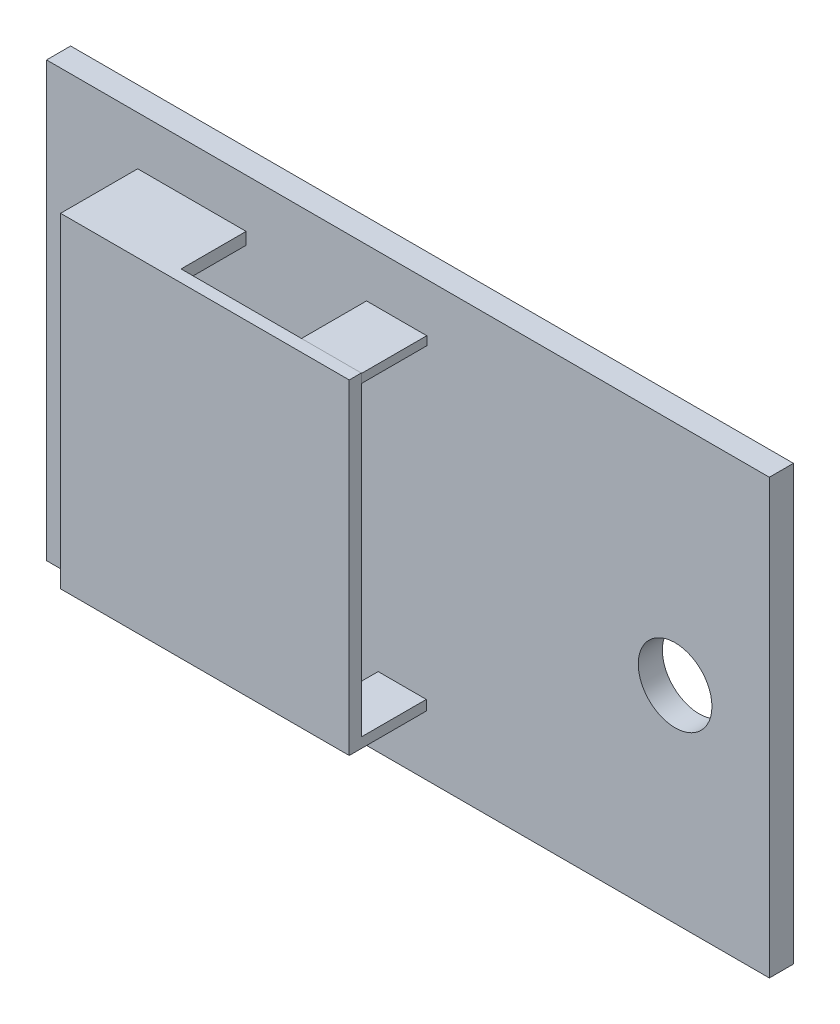
ISO-10303-21;
HEADER;
FILE_DESCRIPTION(('STEP AP214'),'2;1');
FILE_NAME('part.step','',(''),(''),'','','');
FILE_SCHEMA(('AUTOMOTIVE_DESIGN { 1 0 10303 214 1 1 1 1 }'));
ENDSEC;
DATA;
#1=APPLICATION_CONTEXT('core data for automotive mechanical design processes');
#2=APPLICATION_PROTOCOL_DEFINITION('international standard','automotive_design',2000,#1);
#3=PRODUCT_CONTEXT('',#1,'mechanical');
#4=PRODUCT('Part','Part','',(#3));
#5=PRODUCT_RELATED_PRODUCT_CATEGORY('part','',(#4));
#6=PRODUCT_DEFINITION_FORMATION('','',#4);
#7=PRODUCT_DEFINITION_CONTEXT('part definition',#1,'design');
#8=PRODUCT_DEFINITION('design','',#6,#7);
#9=PRODUCT_DEFINITION_SHAPE('','',#8);
#10=(LENGTH_UNIT() NAMED_UNIT(*) SI_UNIT(.MILLI.,.METRE.));
#11=(NAMED_UNIT(*) PLANE_ANGLE_UNIT() SI_UNIT($,.RADIAN.));
#12=(NAMED_UNIT(*) SI_UNIT($,.STERADIAN.) SOLID_ANGLE_UNIT());
#13=UNCERTAINTY_MEASURE_WITH_UNIT(LENGTH_MEASURE(1.E-05),#10,'distance_accuracy_value','');
#14=(GEOMETRIC_REPRESENTATION_CONTEXT(3) GLOBAL_UNCERTAINTY_ASSIGNED_CONTEXT((#13)) GLOBAL_UNIT_ASSIGNED_CONTEXT((#10,
#11,#12)) REPRESENTATION_CONTEXT('',''));
#15=CARTESIAN_POINT('',(0.,0.,0.));
#16=DIRECTION('',(0.,0.,1.));
#17=DIRECTION('',(1.,0.,0.));
#18=AXIS2_PLACEMENT_3D('',#15,#16,#17);
#19=CARTESIAN_POINT('',(0.,0.,37.));
#20=DIRECTION('',(0.,0.,-1.));
#21=DIRECTION('',(-1.,0.,0.));
#22=AXIS2_PLACEMENT_3D('',#19,#20,#21);
#23=PLANE('',#22);
#24=DIRECTION('',(0.,1.,0.));
#25=VECTOR('',#24,1.);
#26=CARTESIAN_POINT('',(58.2309614627117,13.2146675759325,37.));
#27=LINE('',#26,#25);
#28=CARTESIAN_POINT('',(58.2309614627117,9.58317186335365,37.));
#29=VERTEX_POINT('',#28);
#30=CARTESIAN_POINT('',(58.2309614627117,13.2085531623903,37.));
#31=VERTEX_POINT('',#30);
#32=EDGE_CURVE('E61',#29,#31,#27,.T.);
#33=ORIENTED_EDGE('',*,*,#32,.F.);
#34=DIRECTION('',(1.,0.,0.));
#35=VECTOR('',#34,1.);
#36=CARTESIAN_POINT('',(33.4142818054913,9.58317186335365,37.));
#37=LINE('',#36,#35);
#38=CARTESIAN_POINT('',(58.4142818054913,9.58317186335365,37.));
#39=VERTEX_POINT('',#38);
#40=EDGE_CURVE('E349',#29,#39,#37,.T.);
#41=ORIENTED_EDGE('',*,*,#40,.T.);
#42=DIRECTION('',(0.,1.,0.));
#43=VECTOR('',#42,1.);
#44=CARTESIAN_POINT('',(58.4142818054913,9.58317186335365,37.));
#45=LINE('',#44,#43);
#46=CARTESIAN_POINT('',(58.4142818054913,13.2085531623903,37.));
#47=VERTEX_POINT('',#46);
#48=EDGE_CURVE('E346',#39,#47,#45,.T.);
#49=ORIENTED_EDGE('',*,*,#48,.T.);
#50=DIRECTION('',(-1.,0.,0.));
#51=VECTOR('',#50,1.);
#52=CARTESIAN_POINT('',(33.4142818054913,13.2085531623903,37.));
#53=LINE('',#52,#51);
#54=EDGE_CURVE('E329',#47,#31,#53,.T.);
#55=ORIENTED_EDGE('',*,*,#54,.T.);
#56=EDGE_LOOP('',(#33,#41,#49,#55));
#57=FACE_BOUND('',#56,.T.);
#58=ADVANCED_FACE('F45',(#57),#23,.F.);
#59=CARTESIAN_POINT('',(0.,0.,10.));
#60=DIRECTION('',(0.,0.,1.));
#61=DIRECTION('',(1.,0.,0.));
#62=AXIS2_PLACEMENT_3D('',#59,#60,#61);
#63=PLANE('',#62);
#64=DIRECTION('',(0.,-1.,0.));
#65=VECTOR('',#64,1.);
#66=CARTESIAN_POINT('',(-99.3975903614459,33.433734939759,10.));
#67=LINE('',#66,#65);
#68=CARTESIAN_POINT('',(-99.3975903614459,33.433734939759,10.));
#69=VERTEX_POINT('',#68);
#70=CARTESIAN_POINT('',(-99.3975903614458,-146.566265060241,10.));
#71=VERTEX_POINT('',#70);
#72=EDGE_CURVE('E398',#69,#71,#67,.T.);
#73=ORIENTED_EDGE('',*,*,#72,.T.);
#74=DIRECTION('',(1.,0.,0.));
#75=VECTOR('',#74,1.);
#76=CARTESIAN_POINT('',(-99.3975903614458,-146.566265060241,10.));
#77=LINE('',#76,#75);
#78=CARTESIAN_POINT('',(200.602409638554,-146.566265060241,10.));
#79=VERTEX_POINT('',#78);
#80=EDGE_CURVE('E402',#71,#79,#77,.T.);
#81=ORIENTED_EDGE('',*,*,#80,.T.);
#82=DIRECTION('',(0.,1.,0.));
#83=VECTOR('',#82,1.);
#84=CARTESIAN_POINT('',(200.602409638554,33.433734939759,10.));
#85=LINE('',#84,#83);
#86=CARTESIAN_POINT('',(200.602409638554,33.433734939759,10.));
#87=VERTEX_POINT('',#86);
#88=EDGE_CURVE('E406',#79,#87,#85,.T.);
#89=ORIENTED_EDGE('',*,*,#88,.T.);
#90=DIRECTION('',(-1.,0.,0.));
#91=VECTOR('',#90,1.);
#92=CARTESIAN_POINT('',(-99.3975903614459,33.433734939759,10.));
#93=LINE('',#92,#91);
#94=EDGE_CURVE('E409',#87,#69,#93,.T.);
#95=ORIENTED_EDGE('',*,*,#94,.T.);
#96=EDGE_LOOP('',(#73,#81,#89,#95));
#97=FACE_BOUND('',#96,.T.);
#98=CARTESIAN_POINT('',(161.47442169969,-60.8983015499577,10.));
#99=DIRECTION('',(0.,0.,1.));
#100=DIRECTION('',(1.,0.,0.));
#101=AXIS2_PLACEMENT_3D('',#98,#99,#100);
#102=CIRCLE('',#101,15.2902951864238);
#103=CARTESIAN_POINT('',(176.764716886113,-60.8983015499577,10.));
#104=VERTEX_POINT('',#103);
#105=EDGE_CURVE('E390',#104,#104,#102,.T.);
#106=ORIENTED_EDGE('',*,*,#105,.F.);
#107=EDGE_LOOP('',(#106));
#108=FACE_BOUND('',#107,.T.);
#109=DIRECTION('',(1.,0.,0.));
#110=VECTOR('',#109,1.);
#111=CARTESIAN_POINT('',(38.2309614627117,-121.785332424067,10.));
#112=LINE('',#111,#110);
#113=CARTESIAN_POINT('',(38.2309614627117,-121.785332424067,10.));
#114=VERTEX_POINT('',#113);
#115=CARTESIAN_POINT('',(58.2309614627117,-121.785332424067,10.));
#116=VERTEX_POINT('',#115);
#117=EDGE_CURVE('E378',#114,#116,#112,.T.);
#118=ORIENTED_EDGE('',*,*,#117,.F.);
#119=DIRECTION('',(0.,-1.,0.));
#120=VECTOR('',#119,1.);
#121=CARTESIAN_POINT('',(38.2309614627117,-121.785332424067,10.));
#122=LINE('',#121,#120);
#123=CARTESIAN_POINT('',(38.2309614627117,-117.612412657303,10.));
#124=VERTEX_POINT('',#123);
#125=EDGE_CURVE('E318',#124,#114,#122,.T.);
#126=ORIENTED_EDGE('',*,*,#125,.F.);
#127=DIRECTION('',(-1.,0.,0.));
#128=VECTOR('',#127,1.);
#129=CARTESIAN_POINT('',(38.2309614627117,-117.612412657303,10.));
#130=LINE('',#129,#128);
#131=CARTESIAN_POINT('',(58.2309614627117,-117.612412657303,10.));
#132=VERTEX_POINT('',#131);
#133=EDGE_CURVE('E370',#132,#124,#130,.T.);
#134=ORIENTED_EDGE('',*,*,#133,.F.);
#135=DIRECTION('',(0.,1.,0.));
#136=VECTOR('',#135,1.);
#137=CARTESIAN_POINT('',(58.2309614627117,-121.785332424067,10.));
#138=LINE('',#137,#136);
#139=EDGE_CURVE('E373',#116,#132,#138,.T.);
#140=ORIENTED_EDGE('',*,*,#139,.F.);
#141=EDGE_LOOP('',(#118,#126,#134,#140));
#142=FACE_BOUND('',#141,.T.);
#143=DIRECTION('',(1.,0.,0.));
#144=VECTOR('',#143,1.);
#145=CARTESIAN_POINT('',(33.4142818054913,9.58317186335365,10.));
#146=LINE('',#145,#144);
#147=CARTESIAN_POINT('',(33.4142818054913,9.58317186335365,10.));
#148=VERTEX_POINT('',#147);
#149=CARTESIAN_POINT('',(58.4142818054913,9.58317186335365,10.));
#150=VERTEX_POINT('',#149);
#151=EDGE_CURVE('E338',#148,#150,#146,.T.);
#152=ORIENTED_EDGE('',*,*,#151,.F.);
#153=DIRECTION('',(0.,-1.,0.));
#154=VECTOR('',#153,1.);
#155=CARTESIAN_POINT('',(33.4142818054913,9.58317186335365,10.));
#156=LINE('',#155,#154);
#157=CARTESIAN_POINT('',(33.4142818054913,13.2085531623903,10.));
#158=VERTEX_POINT('',#157);
#159=EDGE_CURVE('E271',#158,#148,#156,.T.);
#160=ORIENTED_EDGE('',*,*,#159,.F.);
#161=DIRECTION('',(-1.,0.,0.));
#162=VECTOR('',#161,1.);
#163=CARTESIAN_POINT('',(33.4142818054913,13.2085531623903,10.));
#164=LINE('',#163,#162);
#165=CARTESIAN_POINT('',(58.4142818054913,13.2085531623903,10.));
#166=VERTEX_POINT('',#165);
#167=EDGE_CURVE('E330',#166,#158,#164,.T.);
#168=ORIENTED_EDGE('',*,*,#167,.F.);
#169=DIRECTION('',(0.,1.,0.));
#170=VECTOR('',#169,1.);
#171=CARTESIAN_POINT('',(58.4142818054913,9.58317186335365,10.));
#172=LINE('',#171,#170);
#173=EDGE_CURVE('E333',#150,#166,#172,.T.);
#174=ORIENTED_EDGE('',*,*,#173,.F.);
#175=EDGE_LOOP('',(#152,#160,#168,#174));
#176=FACE_BOUND('',#175,.T.);
#177=DIRECTION('',(1.,0.,0.));
#178=VECTOR('',#177,1.);
#179=CARTESIAN_POINT('',(-61.5669866459527,-121.785332424067,10.));
#180=LINE('',#179,#178);
#181=CARTESIAN_POINT('',(-61.5669866459527,-121.785332424067,10.));
#182=VERTEX_POINT('',#181);
#183=CARTESIAN_POINT('',(20.4330133540473,-121.785332424067,10.));
#184=VERTEX_POINT('',#183);
#185=EDGE_CURVE('E270',#182,#184,#180,.T.);
#186=ORIENTED_EDGE('',*,*,#185,.F.);
#187=DIRECTION('',(0.,-1.,0.));
#188=VECTOR('',#187,1.);
#189=CARTESIAN_POINT('',(-61.5669866459527,-116.785332424067,10.));
#190=LINE('',#189,#188);
#191=CARTESIAN_POINT('',(-61.5669866459527,13.2146675759325,10.));
#192=VERTEX_POINT('',#191);
#193=EDGE_CURVE('E202',#192,#182,#190,.T.);
#194=ORIENTED_EDGE('',*,*,#193,.F.);
#195=DIRECTION('',(-1.,0.,0.));
#196=VECTOR('',#195,1.);
#197=CARTESIAN_POINT('',(-56.5669866459527,13.2146675759325,10.));
#198=LINE('',#197,#196);
#199=CARTESIAN_POINT('',(-16.5669866459527,13.2146675759325,10.));
#200=VERTEX_POINT('',#199);
#201=EDGE_CURVE('E251',#200,#192,#198,.T.);
#202=ORIENTED_EDGE('',*,*,#201,.F.);
#203=DIRECTION('',(0.,1.,0.));
#204=VECTOR('',#203,1.);
#205=CARTESIAN_POINT('',(-16.5669866459527,8.21466757593252,10.));
#206=LINE('',#205,#204);
#207=CARTESIAN_POINT('',(-16.5669866459527,8.21466757593252,10.));
#208=VERTEX_POINT('',#207);
#209=EDGE_CURVE('E286',#208,#200,#206,.T.);
#210=ORIENTED_EDGE('',*,*,#209,.F.);
#211=DIRECTION('',(1.,0.,0.));
#212=VECTOR('',#211,1.);
#213=CARTESIAN_POINT('',(-56.5669866459527,8.21466757593252,10.));
#214=LINE('',#213,#212);
#215=CARTESIAN_POINT('',(-56.5669866459527,8.21466757593252,10.));
#216=VERTEX_POINT('',#215);
#217=EDGE_CURVE('E283',#216,#208,#214,.T.);
#218=ORIENTED_EDGE('',*,*,#217,.F.);
#219=DIRECTION('',(0.,1.,0.));
#220=VECTOR('',#219,1.);
#221=CARTESIAN_POINT('',(-56.5669866459527,8.21466757593252,10.));
#222=LINE('',#221,#220);
#223=CARTESIAN_POINT('',(-56.5669866459527,-116.785332424067,10.));
#224=VERTEX_POINT('',#223);
#225=EDGE_CURVE('E280',#224,#216,#222,.T.);
#226=ORIENTED_EDGE('',*,*,#225,.F.);
#227=DIRECTION('',(-1.,0.,0.));
#228=VECTOR('',#227,1.);
#229=CARTESIAN_POINT('',(-56.5669866459527,-116.785332424067,10.));
#230=LINE('',#229,#228);
#231=CARTESIAN_POINT('',(20.4330133540473,-116.785332424067,10.));
#232=VERTEX_POINT('',#231);
#233=EDGE_CURVE('E277',#232,#224,#230,.T.);
#234=ORIENTED_EDGE('',*,*,#233,.F.);
#235=DIRECTION('',(0.,1.,0.));
#236=VECTOR('',#235,1.);
#237=CARTESIAN_POINT('',(20.4330133540473,-116.785332424067,10.));
#238=LINE('',#237,#236);
#239=EDGE_CURVE('E274',#184,#232,#238,.T.);
#240=ORIENTED_EDGE('',*,*,#239,.F.);
#241=EDGE_LOOP('',(#186,#194,#202,#210,#218,#226,#234,#240));
#242=FACE_BOUND('',#241,.T.);
#243=ADVANCED_FACE('F452',(#97,#108,#142,#176,#242),#63,.T.);
#244=CARTESIAN_POINT('',(0.,0.,0.));
#245=DIRECTION('',(0.,0.,1.));
#246=DIRECTION('',(1.,0.,0.));
#247=AXIS2_PLACEMENT_3D('',#244,#245,#246);
#248=PLANE('',#247);
#249=DIRECTION('',(0.,-1.,0.));
#250=VECTOR('',#249,1.);
#251=CARTESIAN_POINT('',(-99.3975903614459,33.433734939759,0.));
#252=LINE('',#251,#250);
#253=CARTESIAN_POINT('',(-99.3975903614459,33.433734939759,0.));
#254=VERTEX_POINT('',#253);
#255=CARTESIAN_POINT('',(-99.3975903614458,-146.566265060241,0.));
#256=VERTEX_POINT('',#255);
#257=EDGE_CURVE('E394',#254,#256,#252,.T.);
#258=ORIENTED_EDGE('',*,*,#257,.F.);
#259=DIRECTION('',(-1.,0.,0.));
#260=VECTOR('',#259,1.);
#261=CARTESIAN_POINT('',(-99.3975903614459,33.433734939759,0.));
#262=LINE('',#261,#260);
#263=CARTESIAN_POINT('',(200.602409638554,33.433734939759,0.));
#264=VERTEX_POINT('',#263);
#265=EDGE_CURVE('E403',#264,#254,#262,.T.);
#266=ORIENTED_EDGE('',*,*,#265,.F.);
#267=DIRECTION('',(0.,1.,0.));
#268=VECTOR('',#267,1.);
#269=CARTESIAN_POINT('',(200.602409638554,33.433734939759,0.));
#270=LINE('',#269,#268);
#271=CARTESIAN_POINT('',(200.602409638554,-146.566265060241,0.));
#272=VERTEX_POINT('',#271);
#273=EDGE_CURVE('E419',#272,#264,#270,.T.);
#274=ORIENTED_EDGE('',*,*,#273,.F.);
#275=DIRECTION('',(1.,0.,0.));
#276=VECTOR('',#275,1.);
#277=CARTESIAN_POINT('',(-99.3975903614458,-146.566265060241,0.));
#278=LINE('',#277,#276);
#279=EDGE_CURVE('E416',#256,#272,#278,.T.);
#280=ORIENTED_EDGE('',*,*,#279,.F.);
#281=EDGE_LOOP('',(#258,#266,#274,#280));
#282=FACE_BOUND('',#281,.T.);
#283=CARTESIAN_POINT('',(161.47442169969,-60.8983015499577,0.));
#284=DIRECTION('',(0.,0.,1.));
#285=DIRECTION('',(1.,0.,0.));
#286=AXIS2_PLACEMENT_3D('',#283,#284,#285);
#287=CIRCLE('',#286,15.2902951864238);
#288=CARTESIAN_POINT('',(176.764716886113,-60.8983015499577,0.));
#289=VERTEX_POINT('',#288);
#290=EDGE_CURVE('E206',#289,#289,#287,.T.);
#291=ORIENTED_EDGE('',*,*,#290,.T.);
#292=EDGE_LOOP('',(#291));
#293=FACE_BOUND('',#292,.T.);
#294=ADVANCED_FACE('F442',(#282,#293),#248,.F.);
#295=CARTESIAN_POINT('',(-99.3975903614459,33.433734939759,10.));
#296=DIRECTION('',(1.,0.,0.));
#297=DIRECTION('',(0.,1.,0.));
#298=AXIS2_PLACEMENT_3D('',#295,#296,#297);
#299=PLANE('',#298);
#300=ORIENTED_EDGE('',*,*,#257,.T.);
#301=DIRECTION('',(0.,0.,-1.));
#302=VECTOR('',#301,1.);
#303=CARTESIAN_POINT('',(-99.3975903614458,-146.566265060241,10.));
#304=LINE('',#303,#302);
#305=EDGE_CURVE('E11',#71,#256,#304,.T.);
#306=ORIENTED_EDGE('',*,*,#305,.F.);
#307=ORIENTED_EDGE('',*,*,#72,.F.);
#308=DIRECTION('',(0.,0.,-1.));
#309=VECTOR('',#308,1.);
#310=CARTESIAN_POINT('',(-99.3975903614459,33.433734939759,10.));
#311=LINE('',#310,#309);
#312=EDGE_CURVE('E412',#69,#254,#311,.T.);
#313=ORIENTED_EDGE('',*,*,#312,.T.);
#314=EDGE_LOOP('',(#300,#306,#307,#313));
#315=FACE_BOUND('',#314,.T.);
#316=ADVANCED_FACE('F47',(#315),#299,.F.);
#317=CARTESIAN_POINT('',(-99.3975903614458,-146.566265060241,10.));
#318=DIRECTION('',(0.,1.,0.));
#319=DIRECTION('',(0.,0.,1.));
#320=AXIS2_PLACEMENT_3D('',#317,#318,#319);
#321=PLANE('',#320);
#322=ORIENTED_EDGE('',*,*,#279,.T.);
#323=DIRECTION('',(0.,0.,-1.));
#324=VECTOR('',#323,1.);
#325=CARTESIAN_POINT('',(200.602409638554,-146.566265060241,10.));
#326=LINE('',#325,#324);
#327=EDGE_CURVE('E54',#79,#272,#326,.T.);
#328=ORIENTED_EDGE('',*,*,#327,.F.);
#329=ORIENTED_EDGE('',*,*,#80,.F.);
#330=ORIENTED_EDGE('',*,*,#305,.T.);
#331=EDGE_LOOP('',(#322,#328,#329,#330));
#332=FACE_BOUND('',#331,.T.);
#333=ADVANCED_FACE('F454',(#332),#321,.F.);
#334=CARTESIAN_POINT('',(200.602409638554,33.433734939759,10.));
#335=DIRECTION('',(-1.,0.,0.));
#336=DIRECTION('',(0.,0.,1.));
#337=AXIS2_PLACEMENT_3D('',#334,#335,#336);
#338=PLANE('',#337);
#339=ORIENTED_EDGE('',*,*,#273,.T.);
#340=DIRECTION('',(0.,0.,-1.));
#341=VECTOR('',#340,1.);
#342=CARTESIAN_POINT('',(200.602409638554,33.433734939759,10.));
#343=LINE('',#342,#341);
#344=EDGE_CURVE('E427',#87,#264,#343,.T.);
#345=ORIENTED_EDGE('',*,*,#344,.F.);
#346=ORIENTED_EDGE('',*,*,#88,.F.);
#347=ORIENTED_EDGE('',*,*,#327,.T.);
#348=EDGE_LOOP('',(#339,#345,#346,#347));
#349=FACE_BOUND('',#348,.T.);
#350=ADVANCED_FACE('F436',(#349),#338,.F.);
#351=CARTESIAN_POINT('',(-99.3975903614459,33.433734939759,10.));
#352=DIRECTION('',(0.,-1.,0.));
#353=DIRECTION('',(0.,0.,-1.));
#354=AXIS2_PLACEMENT_3D('',#351,#352,#353);
#355=PLANE('',#354);
#356=ORIENTED_EDGE('',*,*,#265,.T.);
#357=ORIENTED_EDGE('',*,*,#312,.F.);
#358=ORIENTED_EDGE('',*,*,#94,.F.);
#359=ORIENTED_EDGE('',*,*,#344,.T.);
#360=EDGE_LOOP('',(#356,#357,#358,#359));
#361=FACE_BOUND('',#360,.T.);
#362=ADVANCED_FACE('F446',(#361),#355,.F.);
#363=CARTESIAN_POINT('',(161.47442169969,-60.8983015499577,10.));
#364=DIRECTION('',(0.,0.,-1.));
#365=DIRECTION('',(-1.,0.,0.));
#366=AXIS2_PLACEMENT_3D('',#363,#364,#365);
#367=CYLINDRICAL_SURFACE('',#366,15.2902951864238);
#368=ORIENTED_EDGE('',*,*,#105,.T.);
#369=EDGE_LOOP('',(#368));
#370=FACE_BOUND('',#369,.T.);
#371=ORIENTED_EDGE('',*,*,#290,.F.);
#372=EDGE_LOOP('',(#371));
#373=FACE_BOUND('',#372,.T.);
#374=ADVANCED_FACE('F476',(#370,#373),#367,.F.);
#375=CARTESIAN_POINT('',(38.2309614627117,-121.785332424067,37.));
#376=DIRECTION('',(1.,0.,0.));
#377=DIRECTION('',(0.,0.,-1.));
#378=AXIS2_PLACEMENT_3D('',#375,#376,#377);
#379=PLANE('',#378);
#380=ORIENTED_EDGE('',*,*,#125,.T.);
#381=DIRECTION('',(0.,0.,-1.));
#382=VECTOR('',#381,1.);
#383=CARTESIAN_POINT('',(38.2309614627117,-121.785332424067,37.));
#384=LINE('',#383,#382);
#385=CARTESIAN_POINT('',(38.2309614627117,-121.785332424067,37.));
#386=VERTEX_POINT('',#385);
#387=EDGE_CURVE('E357',#386,#114,#384,.T.);
#388=ORIENTED_EDGE('',*,*,#387,.F.);
#389=DIRECTION('',(0.,-1.,0.));
#390=VECTOR('',#389,1.);
#391=CARTESIAN_POINT('',(38.2309614627117,-121.785332424067,37.));
#392=LINE('',#391,#390);
#393=CARTESIAN_POINT('',(38.2309614627117,-117.612412657303,37.));
#394=VERTEX_POINT('',#393);
#395=EDGE_CURVE('E374',#394,#386,#392,.T.);
#396=ORIENTED_EDGE('',*,*,#395,.F.);
#397=DIRECTION('',(0.,0.,-1.));
#398=VECTOR('',#397,1.);
#399=CARTESIAN_POINT('',(38.2309614627117,-117.612412657303,37.));
#400=LINE('',#399,#398);
#401=EDGE_CURVE('E365',#394,#124,#400,.T.);
#402=ORIENTED_EDGE('',*,*,#401,.T.);
#403=EDGE_LOOP('',(#380,#388,#396,#402));
#404=FACE_BOUND('',#403,.T.);
#405=ADVANCED_FACE('F473',(#404),#379,.F.);
#406=CARTESIAN_POINT('',(58.2309614627117,-121.785332424067,37.));
#407=DIRECTION('',(-1.,0.,0.));
#408=DIRECTION('',(0.,0.,1.));
#409=AXIS2_PLACEMENT_3D('',#406,#407,#408);
#410=PLANE('',#409);
#411=ORIENTED_EDGE('',*,*,#139,.T.);
#412=DIRECTION('',(0.,0.,-1.));
#413=VECTOR('',#412,1.);
#414=CARTESIAN_POINT('',(58.2309614627117,-117.612412657303,37.));
#415=LINE('',#414,#413);
#416=CARTESIAN_POINT('',(58.2309614627117,-117.612412657303,37.));
#417=VERTEX_POINT('',#416);
#418=EDGE_CURVE('E362',#417,#132,#415,.T.);
#419=ORIENTED_EDGE('',*,*,#418,.F.);
#420=EDGE_CURVE('E227',#417,#29,#27,.T.);
#421=ORIENTED_EDGE('',*,*,#420,.T.);
#422=ORIENTED_EDGE('',*,*,#32,.T.);
#423=CARTESIAN_POINT('',(58.2309614627117,13.2146675759325,37.));
#424=VERTEX_POINT('',#423);
#425=EDGE_CURVE('E239',#31,#424,#27,.T.);
#426=ORIENTED_EDGE('',*,*,#425,.T.);
#427=DIRECTION('',(0.,0.,-1.));
#428=VECTOR('',#427,1.);
#429=CARTESIAN_POINT('',(58.2309614627117,13.2146675759325,42.));
#430=LINE('',#429,#428);
#431=CARTESIAN_POINT('',(58.2309614627117,13.2146675759325,42.));
#432=VERTEX_POINT('',#431);
#433=EDGE_CURVE('E234',#432,#424,#430,.T.);
#434=ORIENTED_EDGE('',*,*,#433,.F.);
#435=DIRECTION('',(0.,1.,0.));
#436=VECTOR('',#435,1.);
#437=CARTESIAN_POINT('',(58.2309614627117,13.2146675759325,42.));
#438=LINE('',#437,#436);
#439=CARTESIAN_POINT('',(58.2309614627117,-121.785332424067,42.));
#440=VERTEX_POINT('',#439);
#441=EDGE_CURVE('E217',#440,#432,#438,.T.);
#442=ORIENTED_EDGE('',*,*,#441,.F.);
#443=DIRECTION('',(0.,0.,-1.));
#444=VECTOR('',#443,1.);
#445=CARTESIAN_POINT('',(58.2309614627117,-121.785332424067,37.));
#446=LINE('',#445,#444);
#447=EDGE_CURVE('E213',#440,#116,#446,.T.);
#448=ORIENTED_EDGE('',*,*,#447,.T.);
#449=EDGE_LOOP('',(#411,#419,#421,#422,#426,#434,#442,#448));
#450=FACE_BOUND('',#449,.T.);
#451=ADVANCED_FACE('F475',(#450),#410,.F.);
#452=CARTESIAN_POINT('',(38.2309614627117,-117.612412657303,37.));
#453=DIRECTION('',(0.,-1.,0.));
#454=DIRECTION('',(0.,0.,-1.));
#455=AXIS2_PLACEMENT_3D('',#452,#453,#454);
#456=PLANE('',#455);
#457=ORIENTED_EDGE('',*,*,#133,.T.);
#458=ORIENTED_EDGE('',*,*,#401,.F.);
#459=DIRECTION('',(-1.,0.,0.));
#460=VECTOR('',#459,1.);
#461=CARTESIAN_POINT('',(38.2309614627117,-117.612412657303,37.));
#462=LINE('',#461,#460);
#463=EDGE_CURVE('E369',#417,#394,#462,.T.);
#464=ORIENTED_EDGE('',*,*,#463,.F.);
#465=ORIENTED_EDGE('',*,*,#418,.T.);
#466=EDGE_LOOP('',(#457,#458,#464,#465));
#467=FACE_BOUND('',#466,.T.);
#468=ADVANCED_FACE('F480',(#467),#456,.F.);
#469=CARTESIAN_POINT('',(33.4142818054913,9.58317186335365,37.));
#470=DIRECTION('',(1.,0.,0.));
#471=DIRECTION('',(0.,0.,-1.));
#472=AXIS2_PLACEMENT_3D('',#469,#470,#471);
#473=PLANE('',#472);
#474=ORIENTED_EDGE('',*,*,#159,.T.);
#475=DIRECTION('',(0.,0.,-1.));
#476=VECTOR('',#475,1.);
#477=CARTESIAN_POINT('',(33.4142818054913,9.58317186335365,37.));
#478=LINE('',#477,#476);
#479=CARTESIAN_POINT('',(33.4142818054913,9.58317186335365,37.));
#480=VERTEX_POINT('',#479);
#481=EDGE_CURVE('E314',#480,#148,#478,.T.);
#482=ORIENTED_EDGE('',*,*,#481,.F.);
#483=DIRECTION('',(0.,-1.,0.));
#484=VECTOR('',#483,1.);
#485=CARTESIAN_POINT('',(33.4142818054913,9.58317186335365,37.));
#486=LINE('',#485,#484);
#487=CARTESIAN_POINT('',(33.4142818054913,13.2085531623903,37.));
#488=VERTEX_POINT('',#487);
#489=EDGE_CURVE('E334',#488,#480,#486,.T.);
#490=ORIENTED_EDGE('',*,*,#489,.F.);
#491=DIRECTION('',(0.,0.,-1.));
#492=VECTOR('',#491,1.);
#493=CARTESIAN_POINT('',(33.4142818054913,13.2085531623903,37.));
#494=LINE('',#493,#492);
#495=EDGE_CURVE('E325',#488,#158,#494,.T.);
#496=ORIENTED_EDGE('',*,*,#495,.T.);
#497=EDGE_LOOP('',(#474,#482,#490,#496));
#498=FACE_BOUND('',#497,.T.);
#499=ADVANCED_FACE('F484',(#498),#473,.F.);
#500=CARTESIAN_POINT('',(33.4142818054913,9.58317186335365,37.));
#501=DIRECTION('',(0.,1.,0.));
#502=DIRECTION('',(0.,0.,1.));
#503=AXIS2_PLACEMENT_3D('',#500,#501,#502);
#504=PLANE('',#503);
#505=ORIENTED_EDGE('',*,*,#151,.T.);
#506=DIRECTION('',(0.,0.,-1.));
#507=VECTOR('',#506,1.);
#508=CARTESIAN_POINT('',(58.4142818054913,9.58317186335365,37.));
#509=LINE('',#508,#507);
#510=EDGE_CURVE('E317',#39,#150,#509,.T.);
#511=ORIENTED_EDGE('',*,*,#510,.F.);
#512=ORIENTED_EDGE('',*,*,#40,.F.);
#513=EDGE_CURVE('E350',#480,#29,#37,.T.);
#514=ORIENTED_EDGE('',*,*,#513,.F.);
#515=ORIENTED_EDGE('',*,*,#481,.T.);
#516=EDGE_LOOP('',(#505,#511,#512,#514,#515));
#517=FACE_BOUND('',#516,.T.);
#518=ADVANCED_FACE('F512',(#517),#504,.F.);
#519=CARTESIAN_POINT('',(58.4142818054913,9.58317186335365,37.));
#520=DIRECTION('',(-1.,0.,0.));
#521=DIRECTION('',(0.,0.,1.));
#522=AXIS2_PLACEMENT_3D('',#519,#520,#521);
#523=PLANE('',#522);
#524=ORIENTED_EDGE('',*,*,#173,.T.);
#525=DIRECTION('',(0.,0.,-1.));
#526=VECTOR('',#525,1.);
#527=CARTESIAN_POINT('',(58.4142818054913,13.2085531623903,37.));
#528=LINE('',#527,#526);
#529=EDGE_CURVE('E322',#47,#166,#528,.T.);
#530=ORIENTED_EDGE('',*,*,#529,.F.);
#531=ORIENTED_EDGE('',*,*,#48,.F.);
#532=ORIENTED_EDGE('',*,*,#510,.T.);
#533=EDGE_LOOP('',(#524,#530,#531,#532));
#534=FACE_BOUND('',#533,.T.);
#535=ADVANCED_FACE('F509',(#534),#523,.F.);
#536=CARTESIAN_POINT('',(33.4142818054913,13.2085531623903,37.));
#537=DIRECTION('',(0.,-1.,0.));
#538=DIRECTION('',(0.,0.,-1.));
#539=AXIS2_PLACEMENT_3D('',#536,#537,#538);
#540=PLANE('',#539);
#541=ORIENTED_EDGE('',*,*,#167,.T.);
#542=ORIENTED_EDGE('',*,*,#495,.F.);
#543=EDGE_CURVE('E245',#31,#488,#53,.T.);
#544=ORIENTED_EDGE('',*,*,#543,.F.);
#545=ORIENTED_EDGE('',*,*,#54,.F.);
#546=ORIENTED_EDGE('',*,*,#529,.T.);
#547=EDGE_LOOP('',(#541,#542,#544,#545,#546));
#548=FACE_BOUND('',#547,.T.);
#549=ADVANCED_FACE('F471',(#548),#540,.F.);
#550=CARTESIAN_POINT('',(-61.5669866459527,-116.785332424067,37.));
#551=DIRECTION('',(1.,0.,0.));
#552=DIRECTION('',(0.,0.,-1.));
#553=AXIS2_PLACEMENT_3D('',#550,#551,#552);
#554=PLANE('',#553);
#555=ORIENTED_EDGE('',*,*,#193,.T.);
#556=DIRECTION('',(0.,0.,-1.));
#557=VECTOR('',#556,1.);
#558=CARTESIAN_POINT('',(-61.5669866459527,-121.785332424067,37.));
#559=LINE('',#558,#557);
#560=CARTESIAN_POINT('',(-61.5669866459527,-121.785332424067,42.));
#561=VERTEX_POINT('',#560);
#562=EDGE_CURVE('E195',#561,#182,#559,.T.);
#563=ORIENTED_EDGE('',*,*,#562,.F.);
#564=DIRECTION('',(0.,-1.,0.));
#565=VECTOR('',#564,1.);
#566=CARTESIAN_POINT('',(-61.5669866459527,13.2146675759325,42.));
#567=LINE('',#566,#565);
#568=CARTESIAN_POINT('',(-61.5669866459527,13.2146675759325,42.));
#569=VERTEX_POINT('',#568);
#570=EDGE_CURVE('E200',#569,#561,#567,.T.);
#571=ORIENTED_EDGE('',*,*,#570,.F.);
#572=DIRECTION('',(0.,0.,-1.));
#573=VECTOR('',#572,1.);
#574=CARTESIAN_POINT('',(-61.5669866459527,13.2146675759325,37.));
#575=LINE('',#574,#573);
#576=EDGE_CURVE('E267',#569,#192,#575,.T.);
#577=ORIENTED_EDGE('',*,*,#576,.T.);
#578=EDGE_LOOP('',(#555,#563,#571,#577));
#579=FACE_BOUND('',#578,.T.);
#580=ADVANCED_FACE('F197',(#579),#554,.F.);
#581=CARTESIAN_POINT('',(-61.5669866459527,-121.785332424067,37.));
#582=DIRECTION('',(0.,1.,0.));
#583=DIRECTION('',(0.,0.,1.));
#584=AXIS2_PLACEMENT_3D('',#581,#582,#583);
#585=PLANE('',#584);
#586=ORIENTED_EDGE('',*,*,#185,.T.);
#587=DIRECTION('',(0.,0.,-1.));
#588=VECTOR('',#587,1.);
#589=CARTESIAN_POINT('',(20.4330133540473,-121.785332424067,37.));
#590=LINE('',#589,#588);
#591=CARTESIAN_POINT('',(20.4330133540473,-121.785332424067,37.));
#592=VERTEX_POINT('',#591);
#593=EDGE_CURVE('E207',#592,#184,#590,.T.);
#594=ORIENTED_EDGE('',*,*,#593,.F.);
#595=DIRECTION('',(1.,0.,0.));
#596=VECTOR('',#595,1.);
#597=CARTESIAN_POINT('',(-61.5669866459527,-121.785332424067,37.));
#598=LINE('',#597,#596);
#599=EDGE_CURVE('E235',#592,#386,#598,.T.);
#600=ORIENTED_EDGE('',*,*,#599,.T.);
#601=ORIENTED_EDGE('',*,*,#387,.T.);
#602=ORIENTED_EDGE('',*,*,#117,.T.);
#603=ORIENTED_EDGE('',*,*,#447,.F.);
#604=DIRECTION('',(1.,0.,0.));
#605=VECTOR('',#604,1.);
#606=CARTESIAN_POINT('',(-61.5669866459527,-121.785332424067,42.));
#607=LINE('',#606,#605);
#608=EDGE_CURVE('E210',#561,#440,#607,.T.);
#609=ORIENTED_EDGE('',*,*,#608,.F.);
#610=ORIENTED_EDGE('',*,*,#562,.T.);
#611=EDGE_LOOP('',(#586,#594,#600,#601,#602,#603,#609,#610));
#612=FACE_BOUND('',#611,.T.);
#613=ADVANCED_FACE('F211',(#612),#585,.F.);
#614=CARTESIAN_POINT('',(20.4330133540473,-116.785332424067,37.));
#615=DIRECTION('',(-1.,0.,0.));
#616=DIRECTION('',(0.,0.,1.));
#617=AXIS2_PLACEMENT_3D('',#614,#615,#616);
#618=PLANE('',#617);
#619=ORIENTED_EDGE('',*,*,#239,.T.);
#620=DIRECTION('',(0.,0.,-1.));
#621=VECTOR('',#620,1.);
#622=CARTESIAN_POINT('',(20.4330133540473,-116.785332424067,37.));
#623=LINE('',#622,#621);
#624=CARTESIAN_POINT('',(20.4330133540473,-116.785332424067,37.));
#625=VERTEX_POINT('',#624);
#626=EDGE_CURVE('E307',#625,#232,#623,.T.);
#627=ORIENTED_EDGE('',*,*,#626,.F.);
#628=DIRECTION('',(0.,1.,0.));
#629=VECTOR('',#628,1.);
#630=CARTESIAN_POINT('',(20.4330133540473,-116.785332424067,37.));
#631=LINE('',#630,#629);
#632=EDGE_CURVE('E246',#592,#625,#631,.T.);
#633=ORIENTED_EDGE('',*,*,#632,.F.);
#634=ORIENTED_EDGE('',*,*,#593,.T.);
#635=EDGE_LOOP('',(#619,#627,#633,#634));
#636=FACE_BOUND('',#635,.T.);
#637=ADVANCED_FACE('F557',(#636),#618,.F.);
#638=CARTESIAN_POINT('',(-56.5669866459527,-116.785332424067,37.));
#639=DIRECTION('',(0.,-1.,0.));
#640=DIRECTION('',(1.,0.,0.));
#641=AXIS2_PLACEMENT_3D('',#638,#639,#640);
#642=PLANE('',#641);
#643=ORIENTED_EDGE('',*,*,#233,.T.);
#644=DIRECTION('',(0.,0.,-1.));
#645=VECTOR('',#644,1.);
#646=CARTESIAN_POINT('',(-56.5669866459527,-116.785332424067,37.));
#647=LINE('',#646,#645);
#648=CARTESIAN_POINT('',(-56.5669866459527,-116.785332424067,37.));
#649=VERTEX_POINT('',#648);
#650=EDGE_CURVE('E303',#649,#224,#647,.T.);
#651=ORIENTED_EDGE('',*,*,#650,.F.);
#652=DIRECTION('',(-1.,0.,0.));
#653=VECTOR('',#652,1.);
#654=CARTESIAN_POINT('',(-56.5669866459527,-116.785332424067,37.));
#655=LINE('',#654,#653);
#656=EDGE_CURVE('E250',#625,#649,#655,.T.);
#657=ORIENTED_EDGE('',*,*,#656,.F.);
#658=ORIENTED_EDGE('',*,*,#626,.T.);
#659=EDGE_LOOP('',(#643,#651,#657,#658));
#660=FACE_BOUND('',#659,.T.);
#661=ADVANCED_FACE('F568',(#660),#642,.F.);
#662=CARTESIAN_POINT('',(-56.5669866459527,8.21466757593252,37.));
#663=DIRECTION('',(-1.,0.,0.));
#664=DIRECTION('',(0.,-1.,0.));
#665=AXIS2_PLACEMENT_3D('',#662,#663,#664);
#666=PLANE('',#665);
#667=ORIENTED_EDGE('',*,*,#225,.T.);
#668=DIRECTION('',(0.,0.,-1.));
#669=VECTOR('',#668,1.);
#670=CARTESIAN_POINT('',(-56.5669866459527,8.21466757593252,37.));
#671=LINE('',#670,#669);
#672=CARTESIAN_POINT('',(-56.5669866459527,8.21466757593252,37.));
#673=VERTEX_POINT('',#672);
#674=EDGE_CURVE('E299',#673,#216,#671,.T.);
#675=ORIENTED_EDGE('',*,*,#674,.F.);
#676=DIRECTION('',(0.,1.,0.));
#677=VECTOR('',#676,1.);
#678=CARTESIAN_POINT('',(-56.5669866459527,8.21466757593252,37.));
#679=LINE('',#678,#677);
#680=EDGE_CURVE('E255',#649,#673,#679,.T.);
#681=ORIENTED_EDGE('',*,*,#680,.F.);
#682=ORIENTED_EDGE('',*,*,#650,.T.);
#683=EDGE_LOOP('',(#667,#675,#681,#682));
#684=FACE_BOUND('',#683,.T.);
#685=ADVANCED_FACE('F578',(#684),#666,.F.);
#686=CARTESIAN_POINT('',(-56.5669866459527,8.21466757593252,37.));
#687=DIRECTION('',(0.,1.,0.));
#688=DIRECTION('',(0.,0.,1.));
#689=AXIS2_PLACEMENT_3D('',#686,#687,#688);
#690=PLANE('',#689);
#691=ORIENTED_EDGE('',*,*,#217,.T.);
#692=DIRECTION('',(0.,0.,-1.));
#693=VECTOR('',#692,1.);
#694=CARTESIAN_POINT('',(-16.5669866459527,8.21466757593252,37.));
#695=LINE('',#694,#693);
#696=CARTESIAN_POINT('',(-16.5669866459527,8.21466757593252,37.));
#697=VERTEX_POINT('',#696);
#698=EDGE_CURVE('E295',#697,#208,#695,.T.);
#699=ORIENTED_EDGE('',*,*,#698,.F.);
#700=DIRECTION('',(1.,0.,0.));
#701=VECTOR('',#700,1.);
#702=CARTESIAN_POINT('',(-56.5669866459527,8.21466757593252,37.));
#703=LINE('',#702,#701);
#704=EDGE_CURVE('E259',#673,#697,#703,.T.);
#705=ORIENTED_EDGE('',*,*,#704,.F.);
#706=ORIENTED_EDGE('',*,*,#674,.T.);
#707=EDGE_LOOP('',(#691,#699,#705,#706));
#708=FACE_BOUND('',#707,.T.);
#709=ADVANCED_FACE('F588',(#708),#690,.F.);
#710=CARTESIAN_POINT('',(-16.5669866459527,8.21466757593252,37.));
#711=DIRECTION('',(-1.,0.,0.));
#712=DIRECTION('',(0.,0.,1.));
#713=AXIS2_PLACEMENT_3D('',#710,#711,#712);
#714=PLANE('',#713);
#715=ORIENTED_EDGE('',*,*,#209,.T.);
#716=DIRECTION('',(0.,0.,-1.));
#717=VECTOR('',#716,1.);
#718=CARTESIAN_POINT('',(-16.5669866459527,13.2146675759325,37.));
#719=LINE('',#718,#717);
#720=CARTESIAN_POINT('',(-16.5669866459527,13.2146675759325,37.));
#721=VERTEX_POINT('',#720);
#722=EDGE_CURVE('E69',#721,#200,#719,.T.);
#723=ORIENTED_EDGE('',*,*,#722,.F.);
#724=DIRECTION('',(0.,1.,0.));
#725=VECTOR('',#724,1.);
#726=CARTESIAN_POINT('',(-16.5669866459527,8.21466757593252,37.));
#727=LINE('',#726,#725);
#728=EDGE_CURVE('E263',#697,#721,#727,.T.);
#729=ORIENTED_EDGE('',*,*,#728,.F.);
#730=ORIENTED_EDGE('',*,*,#698,.T.);
#731=EDGE_LOOP('',(#715,#723,#729,#730));
#732=FACE_BOUND('',#731,.T.);
#733=ADVANCED_FACE('F598',(#732),#714,.F.);
#734=CARTESIAN_POINT('',(-56.5669866459527,13.2146675759325,37.));
#735=DIRECTION('',(0.,-1.,0.));
#736=DIRECTION('',(0.,0.,-1.));
#737=AXIS2_PLACEMENT_3D('',#734,#735,#736);
#738=PLANE('',#737);
#739=ORIENTED_EDGE('',*,*,#201,.T.);
#740=ORIENTED_EDGE('',*,*,#576,.F.);
#741=DIRECTION('',(-1.,0.,0.));
#742=VECTOR('',#741,1.);
#743=CARTESIAN_POINT('',(-61.5669866459527,13.2146675759325,42.));
#744=LINE('',#743,#742);
#745=EDGE_CURVE('E222',#432,#569,#744,.T.);
#746=ORIENTED_EDGE('',*,*,#745,.F.);
#747=ORIENTED_EDGE('',*,*,#433,.T.);
#748=DIRECTION('',(-1.,0.,0.));
#749=VECTOR('',#748,1.);
#750=CARTESIAN_POINT('',(-61.5669866459527,13.2146675759325,37.));
#751=LINE('',#750,#749);
#752=EDGE_CURVE('E224',#424,#721,#751,.T.);
#753=ORIENTED_EDGE('',*,*,#752,.T.);
#754=ORIENTED_EDGE('',*,*,#722,.T.);
#755=EDGE_LOOP('',(#739,#740,#746,#747,#753,#754));
#756=FACE_BOUND('',#755,.T.);
#757=ADVANCED_FACE('F608',(#756),#738,.F.);
#758=CARTESIAN_POINT('',(0.,0.,37.));
#759=DIRECTION('',(0.,0.,1.));
#760=DIRECTION('',(1.,0.,0.));
#761=AXIS2_PLACEMENT_3D('',#758,#759,#760);
#762=PLANE('',#761);
#763=ORIENTED_EDGE('',*,*,#463,.T.);
#764=ORIENTED_EDGE('',*,*,#395,.T.);
#765=ORIENTED_EDGE('',*,*,#599,.F.);
#766=ORIENTED_EDGE('',*,*,#632,.T.);
#767=ORIENTED_EDGE('',*,*,#656,.T.);
#768=ORIENTED_EDGE('',*,*,#680,.T.);
#769=ORIENTED_EDGE('',*,*,#704,.T.);
#770=ORIENTED_EDGE('',*,*,#728,.T.);
#771=ORIENTED_EDGE('',*,*,#752,.F.);
#772=ORIENTED_EDGE('',*,*,#425,.F.);
#773=ORIENTED_EDGE('',*,*,#543,.T.);
#774=ORIENTED_EDGE('',*,*,#489,.T.);
#775=ORIENTED_EDGE('',*,*,#513,.T.);
#776=ORIENTED_EDGE('',*,*,#420,.F.);
#777=EDGE_LOOP('',(#763,#764,#765,#766,#767,#768,#769,#770,#771,#772,#773,#774,#775,#776));
#778=FACE_BOUND('',#777,.T.);
#779=ADVANCED_FACE('F618',(#778),#762,.F.);
#780=CARTESIAN_POINT('',(0.,0.,42.));
#781=DIRECTION('',(0.,0.,1.));
#782=DIRECTION('',(1.,0.,0.));
#783=AXIS2_PLACEMENT_3D('',#780,#781,#782);
#784=PLANE('',#783);
#785=ORIENTED_EDGE('',*,*,#570,.T.);
#786=ORIENTED_EDGE('',*,*,#608,.T.);
#787=ORIENTED_EDGE('',*,*,#441,.T.);
#788=ORIENTED_EDGE('',*,*,#745,.T.);
#789=EDGE_LOOP('',(#785,#786,#787,#788));
#790=FACE_BOUND('',#789,.T.);
#791=ADVANCED_FACE('F220',(#790),#784,.T.);
#792=CLOSED_SHELL('',(#58,#243,#294,#316,#333,#350,#362,#374,#405,#451,#468,#499,#518,#535,#549,
#580,#613,#637,#661,#685,#709,#733,#757,#779,#791));
#793=MANIFOLD_SOLID_BREP('B2',#792);
#794=ADVANCED_BREP_SHAPE_REPRESENTATION('',(#18,#793),#14);
#795=SHAPE_DEFINITION_REPRESENTATION(#9,#794);
ENDSEC;
END-ISO-10303-21;
